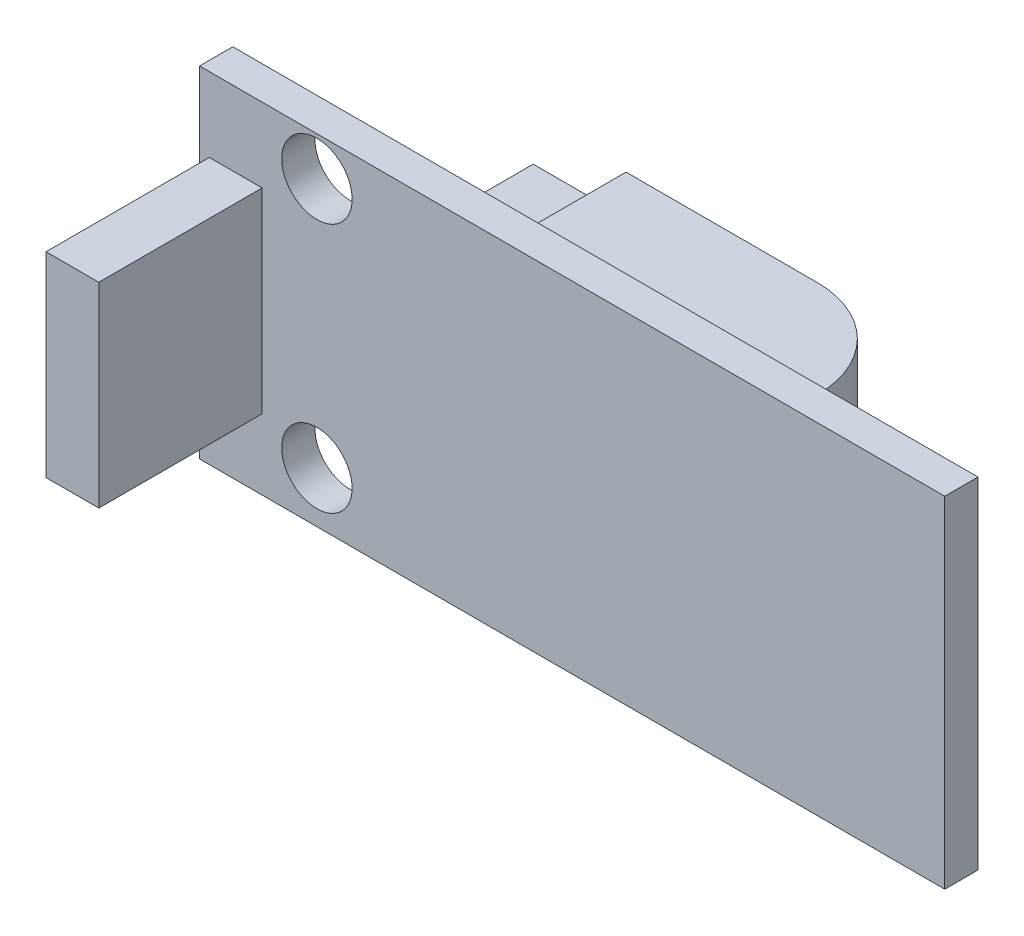
ISO-10303-21;
HEADER;
FILE_DESCRIPTION(('STEP AP214'),'2;1');
FILE_NAME('part.step','',(''),(''),'','','');
FILE_SCHEMA(('AUTOMOTIVE_DESIGN { 1 0 10303 214 1 1 1 1 }'));
ENDSEC;
DATA;
#1=APPLICATION_CONTEXT('core data for automotive mechanical design processes');
#2=APPLICATION_PROTOCOL_DEFINITION('international standard','automotive_design',2000,#1);
#3=PRODUCT_CONTEXT('',#1,'mechanical');
#4=PRODUCT('Part','Part','',(#3));
#5=PRODUCT_RELATED_PRODUCT_CATEGORY('part','',(#4));
#6=PRODUCT_DEFINITION_FORMATION('','',#4);
#7=PRODUCT_DEFINITION_CONTEXT('part definition',#1,'design');
#8=PRODUCT_DEFINITION('design','',#6,#7);
#9=PRODUCT_DEFINITION_SHAPE('','',#8);
#10=(LENGTH_UNIT() NAMED_UNIT(*) SI_UNIT(.MILLI.,.METRE.));
#11=(NAMED_UNIT(*) PLANE_ANGLE_UNIT() SI_UNIT($,.RADIAN.));
#12=(NAMED_UNIT(*) SI_UNIT($,.STERADIAN.) SOLID_ANGLE_UNIT());
#13=UNCERTAINTY_MEASURE_WITH_UNIT(LENGTH_MEASURE(1.E-05),#10,'distance_accuracy_value','');
#14=(GEOMETRIC_REPRESENTATION_CONTEXT(3) GLOBAL_UNCERTAINTY_ASSIGNED_CONTEXT((#13)) GLOBAL_UNIT_ASSIGNED_CONTEXT((#10,
#11,#12)) REPRESENTATION_CONTEXT('',''));
#15=CARTESIAN_POINT('',(0.,0.,0.));
#16=DIRECTION('',(0.,0.,1.));
#17=DIRECTION('',(1.,0.,0.));
#18=AXIS2_PLACEMENT_3D('',#15,#16,#17);
#19=CARTESIAN_POINT('',(0.,0.,0.));
#20=DIRECTION('',(0.,0.,-1.));
#21=DIRECTION('',(-1.,0.,0.));
#22=AXIS2_PLACEMENT_3D('',#19,#20,#21);
#23=PLANE('',#22);
#24=DIRECTION('',(0.,1.,0.));
#25=VECTOR('',#24,1.);
#26=CARTESIAN_POINT('',(-18.55,0.,0.));
#27=LINE('',#26,#25);
#28=CARTESIAN_POINT('',(-18.55,-5.1,0.));
#29=VERTEX_POINT('',#28);
#30=CARTESIAN_POINT('',(-18.55,4.9,0.));
#31=VERTEX_POINT('',#30);
#32=EDGE_CURVE('E346',#29,#31,#27,.T.);
#33=ORIENTED_EDGE('',*,*,#32,.F.);
#34=DIRECTION('',(-1.,0.,0.));
#35=VECTOR('',#34,1.);
#36=CARTESIAN_POINT('',(0.,-5.1,0.));
#37=LINE('',#36,#35);
#38=CARTESIAN_POINT('',(-15.85,-5.1,0.));
#39=VERTEX_POINT('',#38);
#40=EDGE_CURVE('E338',#39,#29,#37,.T.);
#41=ORIENTED_EDGE('',*,*,#40,.F.);
#42=DIRECTION('',(0.,-1.,0.));
#43=VECTOR('',#42,1.);
#44=CARTESIAN_POINT('',(-15.85,0.,0.));
#45=LINE('',#44,#43);
#46=CARTESIAN_POINT('',(-15.85,4.9,0.));
#47=VERTEX_POINT('',#46);
#48=EDGE_CURVE('E341',#47,#39,#45,.T.);
#49=ORIENTED_EDGE('',*,*,#48,.F.);
#50=DIRECTION('',(1.,0.,0.));
#51=VECTOR('',#50,1.);
#52=CARTESIAN_POINT('',(0.,4.9,0.));
#53=LINE('',#52,#51);
#54=EDGE_CURVE('E342',#31,#47,#53,.T.);
#55=ORIENTED_EDGE('',*,*,#54,.F.);
#56=EDGE_LOOP('',(#33,#41,#49,#55));
#57=FACE_BOUND('',#56,.T.);
#58=CARTESIAN_POINT('',(-13.05,6.7,0.));
#59=DIRECTION('',(0.,0.,1.));
#60=DIRECTION('',(1.,0.,0.));
#61=AXIS2_PLACEMENT_3D('',#58,#59,#60);
#62=CIRCLE('',#61,1.8);
#63=CARTESIAN_POINT('',(-11.25,6.7,0.));
#64=VERTEX_POINT('',#63);
#65=EDGE_CURVE('E304',#64,#64,#62,.T.);
#66=ORIENTED_EDGE('',*,*,#65,.T.);
#67=EDGE_LOOP('',(#66));
#68=FACE_BOUND('',#67,.T.);
#69=DIRECTION('',(-1.,0.,0.));
#70=VECTOR('',#69,1.);
#71=CARTESIAN_POINT('',(19.05,8.7,0.));
#72=LINE('',#71,#70);
#73=CARTESIAN_POINT('',(19.05,8.7,0.));
#74=VERTEX_POINT('',#73);
#75=CARTESIAN_POINT('',(-19.05,8.7,0.));
#76=VERTEX_POINT('',#75);
#77=EDGE_CURVE('E307',#74,#76,#72,.T.);
#78=ORIENTED_EDGE('',*,*,#77,.F.);
#79=DIRECTION('',(0.,1.,0.));
#80=VECTOR('',#79,1.);
#81=CARTESIAN_POINT('',(19.05,-8.7,0.));
#82=LINE('',#81,#80);
#83=CARTESIAN_POINT('',(19.05,-8.7,0.));
#84=VERTEX_POINT('',#83);
#85=EDGE_CURVE('E314',#84,#74,#82,.T.);
#86=ORIENTED_EDGE('',*,*,#85,.F.);
#87=DIRECTION('',(1.,0.,0.));
#88=VECTOR('',#87,1.);
#89=CARTESIAN_POINT('',(19.05,-8.7,0.));
#90=LINE('',#89,#88);
#91=CARTESIAN_POINT('',(-19.05,-8.7,0.));
#92=VERTEX_POINT('',#91);
#93=EDGE_CURVE('E324',#92,#84,#90,.T.);
#94=ORIENTED_EDGE('',*,*,#93,.F.);
#95=DIRECTION('',(0.,-1.,0.));
#96=VECTOR('',#95,1.);
#97=CARTESIAN_POINT('',(-19.05,-8.7,0.));
#98=LINE('',#97,#96);
#99=EDGE_CURVE('E323',#76,#92,#98,.T.);
#100=ORIENTED_EDGE('',*,*,#99,.F.);
#101=EDGE_LOOP('',(#78,#86,#94,#100));
#102=FACE_BOUND('',#101,.T.);
#103=CARTESIAN_POINT('',(-13.05,-6.1,0.));
#104=DIRECTION('',(0.,0.,1.));
#105=DIRECTION('',(1.,0.,0.));
#106=AXIS2_PLACEMENT_3D('',#103,#104,#105);
#107=CIRCLE('',#106,1.8);
#108=CARTESIAN_POINT('',(-11.25,-6.1,0.));
#109=VERTEX_POINT('',#108);
#110=EDGE_CURVE('E296',#109,#109,#107,.T.);
#111=ORIENTED_EDGE('',*,*,#110,.T.);
#112=EDGE_LOOP('',(#111));
#113=FACE_BOUND('',#112,.T.);
#114=DIRECTION('',(1.,0.,0.));
#115=VECTOR('',#114,1.);
#116=CARTESIAN_POINT('',(-10.6906250632349,4.18226650825444,0.));
#117=LINE('',#116,#115);
#118=CARTESIAN_POINT('',(-10.6906250632349,4.18226650825444,0.));
#119=VERTEX_POINT('',#118);
#120=CARTESIAN_POINT('',(-5.94445745274382,4.18226650825444,0.));
#121=VERTEX_POINT('',#120);
#122=EDGE_CURVE('E429',#119,#121,#117,.T.);
#123=ORIENTED_EDGE('',*,*,#122,.F.);
#124=DIRECTION('',(0.,1.,0.));
#125=VECTOR('',#124,1.);
#126=CARTESIAN_POINT('',(-10.6906250632349,4.18226650825444,0.));
#127=LINE('',#126,#125);
#128=CARTESIAN_POINT('',(-10.6906250632349,-4.46421705937278,0.));
#129=VERTEX_POINT('',#128);
#130=EDGE_CURVE('E236',#129,#119,#127,.T.);
#131=ORIENTED_EDGE('',*,*,#130,.F.);
#132=DIRECTION('',(-1.,0.,0.));
#133=VECTOR('',#132,1.);
#134=CARTESIAN_POINT('',(-10.6906250632349,-4.46421705937278,0.));
#135=LINE('',#134,#133);
#136=CARTESIAN_POINT('',(-5.85047393570431,-4.46421705937278,0.));
#137=VERTEX_POINT('',#136);
#138=EDGE_CURVE('E233',#137,#129,#135,.T.);
#139=ORIENTED_EDGE('',*,*,#138,.F.);
#140=DIRECTION('',(0.,1.,0.));
#141=VECTOR('',#140,1.);
#142=CARTESIAN_POINT('',(-5.85047393570431,-4.46421705937278,0.));
#143=LINE('',#142,#141);
#144=CARTESIAN_POINT('',(-5.85047393570431,-6.10892860756279,0.));
#145=VERTEX_POINT('',#144);
#146=EDGE_CURVE('E445',#145,#137,#143,.T.);
#147=ORIENTED_EDGE('',*,*,#146,.F.);
#148=DIRECTION('',(-1.,0.,0.));
#149=VECTOR('',#148,1.);
#150=CARTESIAN_POINT('',(-5.85047393570431,-6.10892860756279,0.));
#151=LINE('',#150,#149);
#152=CARTESIAN_POINT('',(8.81095472244626,-6.10892860756279,0.));
#153=VERTEX_POINT('',#152);
#154=EDGE_CURVE('E439',#153,#145,#151,.T.);
#155=ORIENTED_EDGE('',*,*,#154,.F.);
#156=DIRECTION('',(0.,-1.,0.));
#157=VECTOR('',#156,1.);
#158=CARTESIAN_POINT('',(8.81095472244626,-2.49056320154484,0.));
#159=LINE('',#158,#157);
#160=CARTESIAN_POINT('',(8.81095472244626,-2.49056320154484,0.));
#161=VERTEX_POINT('',#160);
#162=EDGE_CURVE('E394',#161,#153,#159,.T.);
#163=ORIENTED_EDGE('',*,*,#162,.F.);
#164=DIRECTION('',(1.,0.,0.));
#165=VECTOR('',#164,1.);
#166=CARTESIAN_POINT('',(1.71519918596956,-2.49056320154484,0.));
#167=LINE('',#166,#165);
#168=CARTESIAN_POINT('',(1.71519918596956,-2.49056320154484,0.));
#169=VERTEX_POINT('',#168);
#170=EDGE_CURVE('E440',#169,#161,#167,.T.);
#171=ORIENTED_EDGE('',*,*,#170,.F.);
#172=DIRECTION('',(0.,-1.,0.));
#173=VECTOR('',#172,1.);
#174=CARTESIAN_POINT('',(1.71519918596956,2.39657968450545,0.));
#175=LINE('',#174,#173);
#176=CARTESIAN_POINT('',(1.71519918596956,2.39657968450545,0.));
#177=VERTEX_POINT('',#176);
#178=EDGE_CURVE('E434',#177,#169,#175,.T.);
#179=ORIENTED_EDGE('',*,*,#178,.F.);
#180=DIRECTION('',(-1.,0.,0.));
#181=VECTOR('',#180,1.);
#182=CARTESIAN_POINT('',(1.71519918596956,2.39657968450545,0.));
#183=LINE('',#182,#181);
#184=CARTESIAN_POINT('',(8.81095472244626,2.39657968450545,0.));
#185=VERTEX_POINT('',#184);
#186=EDGE_CURVE('E428',#185,#177,#183,.T.);
#187=ORIENTED_EDGE('',*,*,#186,.F.);
#188=DIRECTION('',(0.,-1.,0.));
#189=VECTOR('',#188,1.);
#190=CARTESIAN_POINT('',(8.81095472244626,6.20291212460223,0.));
#191=LINE('',#190,#189);
#192=CARTESIAN_POINT('',(8.81095472244626,6.20291212460223,0.));
#193=VERTEX_POINT('',#192);
#194=EDGE_CURVE('E426',#193,#185,#191,.T.);
#195=ORIENTED_EDGE('',*,*,#194,.F.);
#196=DIRECTION('',(1.,0.,0.));
#197=VECTOR('',#196,1.);
#198=CARTESIAN_POINT('',(-5.94445745274382,6.20291212460223,0.));
#199=LINE('',#198,#197);
#200=CARTESIAN_POINT('',(-5.94445745274382,6.20291212460223,0.));
#201=VERTEX_POINT('',#200);
#202=EDGE_CURVE('E418',#201,#193,#199,.T.);
#203=ORIENTED_EDGE('',*,*,#202,.F.);
#204=DIRECTION('',(0.,1.,0.));
#205=VECTOR('',#204,1.);
#206=CARTESIAN_POINT('',(-5.94445745274382,6.20291212460223,0.));
#207=LINE('',#206,#205);
#208=EDGE_CURVE('E421',#121,#201,#207,.T.);
#209=ORIENTED_EDGE('',*,*,#208,.F.);
#210=EDGE_LOOP('',(#123,#131,#139,#147,#155,#163,#171,#179,#187,#195,#203,#209));
#211=FACE_BOUND('',#210,.T.);
#212=ADVANCED_FACE('F43',(#57,#68,#102,#113,#211),#23,.T.);
#213=CARTESIAN_POINT('',(0.,0.,1.7));
#214=DIRECTION('',(0.,0.,-1.));
#215=DIRECTION('',(-1.,0.,0.));
#216=AXIS2_PLACEMENT_3D('',#213,#214,#215);
#217=PLANE('',#216);
#218=DIRECTION('',(-1.,0.,0.));
#219=VECTOR('',#218,1.);
#220=CARTESIAN_POINT('',(0.,-5.1,1.7));
#221=LINE('',#220,#219);
#222=CARTESIAN_POINT('',(-15.85,-5.1,1.7));
#223=VERTEX_POINT('',#222);
#224=CARTESIAN_POINT('',(-18.55,-5.1,1.7));
#225=VERTEX_POINT('',#224);
#226=EDGE_CURVE('E272',#223,#225,#221,.T.);
#227=ORIENTED_EDGE('',*,*,#226,.T.);
#228=DIRECTION('',(0.,1.,0.));
#229=VECTOR('',#228,1.);
#230=CARTESIAN_POINT('',(-18.55,0.,1.7));
#231=LINE('',#230,#229);
#232=CARTESIAN_POINT('',(-18.55,4.9,1.7));
#233=VERTEX_POINT('',#232);
#234=EDGE_CURVE('E294',#225,#233,#231,.T.);
#235=ORIENTED_EDGE('',*,*,#234,.T.);
#236=DIRECTION('',(1.,0.,0.));
#237=VECTOR('',#236,1.);
#238=CARTESIAN_POINT('',(0.,4.9,1.7));
#239=LINE('',#238,#237);
#240=CARTESIAN_POINT('',(-15.85,4.9,1.7));
#241=VERTEX_POINT('',#240);
#242=EDGE_CURVE('E292',#233,#241,#239,.T.);
#243=ORIENTED_EDGE('',*,*,#242,.T.);
#244=DIRECTION('',(0.,-1.,0.));
#245=VECTOR('',#244,1.);
#246=CARTESIAN_POINT('',(-15.85,0.,1.7));
#247=LINE('',#246,#245);
#248=EDGE_CURVE('E290',#241,#223,#247,.T.);
#249=ORIENTED_EDGE('',*,*,#248,.T.);
#250=EDGE_LOOP('',(#227,#235,#243,#249));
#251=FACE_BOUND('',#250,.T.);
#252=DIRECTION('',(-1.,0.,0.));
#253=VECTOR('',#252,1.);
#254=CARTESIAN_POINT('',(19.05,8.7,1.7));
#255=LINE('',#254,#253);
#256=CARTESIAN_POINT('',(19.05,8.7,1.7));
#257=VERTEX_POINT('',#256);
#258=CARTESIAN_POINT('',(-19.05,8.7,1.7));
#259=VERTEX_POINT('',#258);
#260=EDGE_CURVE('E309',#257,#259,#255,.T.);
#261=ORIENTED_EDGE('',*,*,#260,.T.);
#262=DIRECTION('',(0.,-1.,0.));
#263=VECTOR('',#262,1.);
#264=CARTESIAN_POINT('',(-19.05,-8.7,1.7));
#265=LINE('',#264,#263);
#266=CARTESIAN_POINT('',(-19.05,-8.7,1.7));
#267=VERTEX_POINT('',#266);
#268=EDGE_CURVE('E311',#259,#267,#265,.T.);
#269=ORIENTED_EDGE('',*,*,#268,.T.);
#270=DIRECTION('',(1.,0.,0.));
#271=VECTOR('',#270,1.);
#272=CARTESIAN_POINT('',(19.05,-8.7,1.7));
#273=LINE('',#272,#271);
#274=CARTESIAN_POINT('',(19.05,-8.7,1.7));
#275=VERTEX_POINT('',#274);
#276=EDGE_CURVE('E316',#267,#275,#273,.T.);
#277=ORIENTED_EDGE('',*,*,#276,.T.);
#278=DIRECTION('',(0.,1.,0.));
#279=VECTOR('',#278,1.);
#280=CARTESIAN_POINT('',(19.05,-8.7,1.7));
#281=LINE('',#280,#279);
#282=EDGE_CURVE('E318',#275,#257,#281,.T.);
#283=ORIENTED_EDGE('',*,*,#282,.T.);
#284=EDGE_LOOP('',(#261,#269,#277,#283));
#285=FACE_BOUND('',#284,.T.);
#286=CARTESIAN_POINT('',(-13.05,6.7,1.7));
#287=DIRECTION('',(0.,0.,1.));
#288=DIRECTION('',(1.,0.,0.));
#289=AXIS2_PLACEMENT_3D('',#286,#287,#288);
#290=CIRCLE('',#289,1.8);
#291=CARTESIAN_POINT('',(-11.25,6.7,1.7));
#292=VERTEX_POINT('',#291);
#293=EDGE_CURVE('E303',#292,#292,#290,.T.);
#294=ORIENTED_EDGE('',*,*,#293,.F.);
#295=EDGE_LOOP('',(#294));
#296=FACE_BOUND('',#295,.T.);
#297=CARTESIAN_POINT('',(-13.05,-6.1,1.7));
#298=DIRECTION('',(0.,0.,1.));
#299=DIRECTION('',(1.,0.,0.));
#300=AXIS2_PLACEMENT_3D('',#297,#298,#299);
#301=CIRCLE('',#300,1.8);
#302=CARTESIAN_POINT('',(-11.25,-6.1,1.7));
#303=VERTEX_POINT('',#302);
#304=EDGE_CURVE('E300',#303,#303,#301,.T.);
#305=ORIENTED_EDGE('',*,*,#304,.F.);
#306=EDGE_LOOP('',(#305));
#307=FACE_BOUND('',#306,.T.);
#308=ADVANCED_FACE('F476',(#251,#285,#296,#307),#217,.F.);
#309=CARTESIAN_POINT('',(19.05,8.7,1.7));
#310=DIRECTION('',(0.,-1.,0.));
#311=DIRECTION('',(0.,0.,-1.));
#312=AXIS2_PLACEMENT_3D('',#309,#310,#311);
#313=PLANE('',#312);
#314=ORIENTED_EDGE('',*,*,#77,.T.);
#315=DIRECTION('',(0.,0.,-1.));
#316=VECTOR('',#315,1.);
#317=CARTESIAN_POINT('',(-19.05,8.7,1.7));
#318=LINE('',#317,#316);
#319=EDGE_CURVE('E339',#259,#76,#318,.T.);
#320=ORIENTED_EDGE('',*,*,#319,.F.);
#321=ORIENTED_EDGE('',*,*,#260,.F.);
#322=DIRECTION('',(0.,0.,-1.));
#323=VECTOR('',#322,1.);
#324=CARTESIAN_POINT('',(19.05,8.7,1.7));
#325=LINE('',#324,#323);
#326=EDGE_CURVE('E319',#257,#74,#325,.T.);
#327=ORIENTED_EDGE('',*,*,#326,.T.);
#328=EDGE_LOOP('',(#314,#320,#321,#327));
#329=FACE_BOUND('',#328,.T.);
#330=ADVANCED_FACE('F486',(#329),#313,.F.);
#331=CARTESIAN_POINT('',(-19.05,-8.7,1.7));
#332=DIRECTION('',(1.,0.,0.));
#333=DIRECTION('',(0.,0.,-1.));
#334=AXIS2_PLACEMENT_3D('',#331,#332,#333);
#335=PLANE('',#334);
#336=ORIENTED_EDGE('',*,*,#99,.T.);
#337=DIRECTION('',(0.,0.,-1.));
#338=VECTOR('',#337,1.);
#339=CARTESIAN_POINT('',(-19.05,-8.7,1.7));
#340=LINE('',#339,#338);
#341=EDGE_CURVE('E334',#267,#92,#340,.T.);
#342=ORIENTED_EDGE('',*,*,#341,.F.);
#343=ORIENTED_EDGE('',*,*,#268,.F.);
#344=ORIENTED_EDGE('',*,*,#319,.T.);
#345=EDGE_LOOP('',(#336,#342,#343,#344));
#346=FACE_BOUND('',#345,.T.);
#347=ADVANCED_FACE('F498',(#346),#335,.F.);
#348=CARTESIAN_POINT('',(19.05,-8.7,1.7));
#349=DIRECTION('',(0.,1.,0.));
#350=DIRECTION('',(0.,0.,1.));
#351=AXIS2_PLACEMENT_3D('',#348,#349,#350);
#352=PLANE('',#351);
#353=ORIENTED_EDGE('',*,*,#93,.T.);
#354=DIRECTION('',(0.,0.,-1.));
#355=VECTOR('',#354,1.);
#356=CARTESIAN_POINT('',(19.05,-8.7,1.7));
#357=LINE('',#356,#355);
#358=EDGE_CURVE('E329',#275,#84,#357,.T.);
#359=ORIENTED_EDGE('',*,*,#358,.F.);
#360=ORIENTED_EDGE('',*,*,#276,.F.);
#361=ORIENTED_EDGE('',*,*,#341,.T.);
#362=EDGE_LOOP('',(#353,#359,#360,#361));
#363=FACE_BOUND('',#362,.T.);
#364=ADVANCED_FACE('F497',(#363),#352,.F.);
#365=CARTESIAN_POINT('',(19.05,-8.7,1.7));
#366=DIRECTION('',(-1.,0.,0.));
#367=DIRECTION('',(0.,0.,1.));
#368=AXIS2_PLACEMENT_3D('',#365,#366,#367);
#369=PLANE('',#368);
#370=ORIENTED_EDGE('',*,*,#85,.T.);
#371=ORIENTED_EDGE('',*,*,#326,.F.);
#372=ORIENTED_EDGE('',*,*,#282,.F.);
#373=ORIENTED_EDGE('',*,*,#358,.T.);
#374=EDGE_LOOP('',(#370,#371,#372,#373));
#375=FACE_BOUND('',#374,.T.);
#376=ADVANCED_FACE('F495',(#375),#369,.F.);
#377=CARTESIAN_POINT('',(-13.05,6.7,1.7));
#378=DIRECTION('',(0.,0.,-1.));
#379=DIRECTION('',(-1.,0.,0.));
#380=AXIS2_PLACEMENT_3D('',#377,#378,#379);
#381=CYLINDRICAL_SURFACE('',#380,1.8);
#382=ORIENTED_EDGE('',*,*,#293,.T.);
#383=EDGE_LOOP('',(#382));
#384=FACE_BOUND('',#383,.T.);
#385=ORIENTED_EDGE('',*,*,#65,.F.);
#386=EDGE_LOOP('',(#385));
#387=FACE_BOUND('',#386,.T.);
#388=ADVANCED_FACE('F494',(#384,#387),#381,.F.);
#389=CARTESIAN_POINT('',(-13.05,-6.1,1.7));
#390=DIRECTION('',(0.,0.,-1.));
#391=DIRECTION('',(-1.,0.,0.));
#392=AXIS2_PLACEMENT_3D('',#389,#390,#391);
#393=CYLINDRICAL_SURFACE('',#392,1.8);
#394=ORIENTED_EDGE('',*,*,#304,.T.);
#395=EDGE_LOOP('',(#394));
#396=FACE_BOUND('',#395,.T.);
#397=ORIENTED_EDGE('',*,*,#110,.F.);
#398=EDGE_LOOP('',(#397));
#399=FACE_BOUND('',#398,.T.);
#400=ADVANCED_FACE('F710',(#396,#399),#393,.F.);
#401=CARTESIAN_POINT('',(0.,0.,-0.65));
#402=DIRECTION('',(0.,0.,1.));
#403=DIRECTION('',(1.,0.,0.));
#404=AXIS2_PLACEMENT_3D('',#401,#402,#403);
#405=PLANE('',#404);
#406=DIRECTION('',(0.,-1.,0.));
#407=VECTOR('',#406,1.);
#408=CARTESIAN_POINT('',(-18.55,4.9,-0.65));
#409=LINE('',#408,#407);
#410=CARTESIAN_POINT('',(-18.55,4.9,-0.65));
#411=VERTEX_POINT('',#410);
#412=CARTESIAN_POINT('',(-18.55,-5.1,-0.65));
#413=VERTEX_POINT('',#412);
#414=EDGE_CURVE('E260',#411,#413,#409,.T.);
#415=ORIENTED_EDGE('',*,*,#414,.F.);
#416=DIRECTION('',(-1.,0.,0.));
#417=VECTOR('',#416,1.);
#418=CARTESIAN_POINT('',(-18.55,4.9,-0.65));
#419=LINE('',#418,#417);
#420=CARTESIAN_POINT('',(-15.85,4.9,-0.65));
#421=VERTEX_POINT('',#420);
#422=EDGE_CURVE('E266',#421,#411,#419,.T.);
#423=ORIENTED_EDGE('',*,*,#422,.F.);
#424=DIRECTION('',(0.,1.,0.));
#425=VECTOR('',#424,1.);
#426=CARTESIAN_POINT('',(-15.85,4.9,-0.65));
#427=LINE('',#426,#425);
#428=CARTESIAN_POINT('',(-15.85,-5.1,-0.65));
#429=VERTEX_POINT('',#428);
#430=EDGE_CURVE('E263',#429,#421,#427,.T.);
#431=ORIENTED_EDGE('',*,*,#430,.F.);
#432=DIRECTION('',(1.,0.,0.));
#433=VECTOR('',#432,1.);
#434=CARTESIAN_POINT('',(-18.55,-5.1,-0.65));
#435=LINE('',#434,#433);
#436=EDGE_CURVE('E257',#413,#429,#435,.T.);
#437=ORIENTED_EDGE('',*,*,#436,.F.);
#438=EDGE_LOOP('',(#415,#423,#431,#437));
#439=FACE_BOUND('',#438,.T.);
#440=ADVANCED_FACE('F699',(#439),#405,.F.);
#441=CARTESIAN_POINT('',(-18.55,-5.1,-0.65));
#442=DIRECTION('',(0.,-1.,0.));
#443=DIRECTION('',(0.,0.,-1.));
#444=AXIS2_PLACEMENT_3D('',#441,#442,#443);
#445=PLANE('',#444);
#446=DIRECTION('',(0.,0.,1.));
#447=VECTOR('',#446,1.);
#448=CARTESIAN_POINT('',(-15.85,-5.1,-0.65));
#449=LINE('',#448,#447);
#450=EDGE_CURVE('E276',#429,#39,#449,.T.);
#451=ORIENTED_EDGE('',*,*,#450,.T.);
#452=ORIENTED_EDGE('',*,*,#40,.T.);
#453=DIRECTION('',(0.,0.,1.));
#454=VECTOR('',#453,1.);
#455=CARTESIAN_POINT('',(-18.55,-5.1,-0.65));
#456=LINE('',#455,#454);
#457=EDGE_CURVE('E285',#413,#29,#456,.T.);
#458=ORIENTED_EDGE('',*,*,#457,.F.);
#459=ORIENTED_EDGE('',*,*,#436,.T.);
#460=EDGE_LOOP('',(#451,#452,#458,#459));
#461=FACE_BOUND('',#460,.T.);
#462=ADVANCED_FACE('F645',(#461),#445,.T.);
#463=CARTESIAN_POINT('',(-15.85,4.9,-0.65));
#464=DIRECTION('',(1.,0.,0.));
#465=DIRECTION('',(0.,0.,-1.));
#466=AXIS2_PLACEMENT_3D('',#463,#464,#465);
#467=PLANE('',#466);
#468=DIRECTION('',(0.,0.,1.));
#469=VECTOR('',#468,1.);
#470=CARTESIAN_POINT('',(-15.85,4.9,-0.65));
#471=LINE('',#470,#469);
#472=EDGE_CURVE('E274',#421,#47,#471,.T.);
#473=ORIENTED_EDGE('',*,*,#472,.T.);
#474=ORIENTED_EDGE('',*,*,#48,.T.);
#475=ORIENTED_EDGE('',*,*,#450,.F.);
#476=ORIENTED_EDGE('',*,*,#430,.T.);
#477=EDGE_LOOP('',(#473,#474,#475,#476));
#478=FACE_BOUND('',#477,.T.);
#479=ADVANCED_FACE('F655',(#478),#467,.T.);
#480=CARTESIAN_POINT('',(-18.55,4.9,-0.65));
#481=DIRECTION('',(0.,1.,0.));
#482=DIRECTION('',(0.,0.,1.));
#483=AXIS2_PLACEMENT_3D('',#480,#481,#482);
#484=PLANE('',#483);
#485=DIRECTION('',(0.,0.,1.));
#486=VECTOR('',#485,1.);
#487=CARTESIAN_POINT('',(-18.55,4.9,-0.65));
#488=LINE('',#487,#486);
#489=EDGE_CURVE('E269',#411,#31,#488,.T.);
#490=ORIENTED_EDGE('',*,*,#489,.T.);
#491=ORIENTED_EDGE('',*,*,#54,.T.);
#492=ORIENTED_EDGE('',*,*,#472,.F.);
#493=ORIENTED_EDGE('',*,*,#422,.T.);
#494=EDGE_LOOP('',(#490,#491,#492,#493));
#495=FACE_BOUND('',#494,.T.);
#496=ADVANCED_FACE('F665',(#495),#484,.T.);
#497=CARTESIAN_POINT('',(-18.55,4.9,-0.65));
#498=DIRECTION('',(-1.,0.,0.));
#499=DIRECTION('',(0.,0.,1.));
#500=AXIS2_PLACEMENT_3D('',#497,#498,#499);
#501=PLANE('',#500);
#502=ORIENTED_EDGE('',*,*,#457,.T.);
#503=ORIENTED_EDGE('',*,*,#32,.T.);
#504=ORIENTED_EDGE('',*,*,#489,.F.);
#505=ORIENTED_EDGE('',*,*,#414,.T.);
#506=EDGE_LOOP('',(#502,#503,#504,#505));
#507=FACE_BOUND('',#506,.T.);
#508=ADVANCED_FACE('F668',(#507),#501,.T.);
#509=ORIENTED_EDGE('',*,*,#234,.F.);
#510=CARTESIAN_POINT('',(-18.55,-5.1,10.05));
#511=VERTEX_POINT('',#510);
#512=EDGE_CURVE('E267',#225,#511,#456,.T.);
#513=ORIENTED_EDGE('',*,*,#512,.T.);
#514=DIRECTION('',(0.,-1.,0.));
#515=VECTOR('',#514,1.);
#516=CARTESIAN_POINT('',(-18.55,4.9,10.05));
#517=LINE('',#516,#515);
#518=CARTESIAN_POINT('',(-18.55,4.9,10.05));
#519=VERTEX_POINT('',#518);
#520=EDGE_CURVE('E238',#519,#511,#517,.T.);
#521=ORIENTED_EDGE('',*,*,#520,.F.);
#522=EDGE_CURVE('E273',#233,#519,#488,.T.);
#523=ORIENTED_EDGE('',*,*,#522,.F.);
#524=EDGE_LOOP('',(#509,#513,#521,#523));
#525=FACE_BOUND('',#524,.T.);
#526=ADVANCED_FACE('F658',(#525),#501,.T.);
#527=ORIENTED_EDGE('',*,*,#242,.F.);
#528=ORIENTED_EDGE('',*,*,#522,.T.);
#529=DIRECTION('',(-1.,0.,0.));
#530=VECTOR('',#529,1.);
#531=CARTESIAN_POINT('',(-18.55,4.9,10.05));
#532=LINE('',#531,#530);
#533=CARTESIAN_POINT('',(-15.85,4.9,10.05));
#534=VERTEX_POINT('',#533);
#535=EDGE_CURVE('E255',#534,#519,#532,.T.);
#536=ORIENTED_EDGE('',*,*,#535,.F.);
#537=EDGE_CURVE('E279',#241,#534,#471,.T.);
#538=ORIENTED_EDGE('',*,*,#537,.F.);
#539=EDGE_LOOP('',(#527,#528,#536,#538));
#540=FACE_BOUND('',#539,.T.);
#541=ADVANCED_FACE('F647',(#540),#484,.T.);
#542=ORIENTED_EDGE('',*,*,#248,.F.);
#543=ORIENTED_EDGE('',*,*,#537,.T.);
#544=DIRECTION('',(0.,1.,0.));
#545=VECTOR('',#544,1.);
#546=CARTESIAN_POINT('',(-15.85,4.9,10.05));
#547=LINE('',#546,#545);
#548=CARTESIAN_POINT('',(-15.85,-5.1,10.05));
#549=VERTEX_POINT('',#548);
#550=EDGE_CURVE('E253',#549,#534,#547,.T.);
#551=ORIENTED_EDGE('',*,*,#550,.F.);
#552=EDGE_CURVE('E281',#223,#549,#449,.T.);
#553=ORIENTED_EDGE('',*,*,#552,.F.);
#554=EDGE_LOOP('',(#542,#543,#551,#553));
#555=FACE_BOUND('',#554,.T.);
#556=ADVANCED_FACE('F640',(#555),#467,.T.);
#557=ORIENTED_EDGE('',*,*,#226,.F.);
#558=ORIENTED_EDGE('',*,*,#552,.T.);
#559=DIRECTION('',(1.,0.,0.));
#560=VECTOR('',#559,1.);
#561=CARTESIAN_POINT('',(-18.55,-5.1,10.05));
#562=LINE('',#561,#560);
#563=EDGE_CURVE('E245',#511,#549,#562,.T.);
#564=ORIENTED_EDGE('',*,*,#563,.F.);
#565=ORIENTED_EDGE('',*,*,#512,.F.);
#566=EDGE_LOOP('',(#557,#558,#564,#565));
#567=FACE_BOUND('',#566,.T.);
#568=ADVANCED_FACE('F627',(#567),#445,.T.);
#569=CARTESIAN_POINT('',(0.,0.,10.05));
#570=DIRECTION('',(0.,0.,1.));
#571=DIRECTION('',(1.,0.,0.));
#572=AXIS2_PLACEMENT_3D('',#569,#570,#571);
#573=PLANE('',#572);
#574=ORIENTED_EDGE('',*,*,#520,.T.);
#575=ORIENTED_EDGE('',*,*,#563,.T.);
#576=ORIENTED_EDGE('',*,*,#550,.T.);
#577=ORIENTED_EDGE('',*,*,#535,.T.);
#578=EDGE_LOOP('',(#574,#575,#576,#577));
#579=FACE_BOUND('',#578,.T.);
#580=ADVANCED_FACE('F620',(#579),#573,.T.);
#581=CARTESIAN_POINT('',(-10.6906250632349,4.18226650825444,-7.));
#582=DIRECTION('',(1.,0.,0.));
#583=DIRECTION('',(0.,0.,-1.));
#584=AXIS2_PLACEMENT_3D('',#581,#582,#583);
#585=PLANE('',#584);
#586=ORIENTED_EDGE('',*,*,#130,.T.);
#587=DIRECTION('',(0.,0.,1.));
#588=VECTOR('',#587,1.);
#589=CARTESIAN_POINT('',(-10.6906250632349,4.18226650825444,-7.));
#590=LINE('',#589,#588);
#591=CARTESIAN_POINT('',(-10.6906250632349,4.18226650825444,-7.));
#592=VERTEX_POINT('',#591);
#593=EDGE_CURVE('E220',#592,#119,#590,.T.);
#594=ORIENTED_EDGE('',*,*,#593,.F.);
#595=DIRECTION('',(0.,1.,0.));
#596=VECTOR('',#595,1.);
#597=CARTESIAN_POINT('',(-10.6906250632349,4.18226650825444,-7.));
#598=LINE('',#597,#596);
#599=CARTESIAN_POINT('',(-10.6906250632349,-4.46421705937278,-7.));
#600=VERTEX_POINT('',#599);
#601=EDGE_CURVE('E221',#600,#592,#598,.T.);
#602=ORIENTED_EDGE('',*,*,#601,.F.);
#603=DIRECTION('',(0.,0.,1.));
#604=VECTOR('',#603,1.);
#605=CARTESIAN_POINT('',(-10.6906250632349,-4.46421705937278,-7.));
#606=LINE('',#605,#604);
#607=EDGE_CURVE('E449',#600,#129,#606,.T.);
#608=ORIENTED_EDGE('',*,*,#607,.T.);
#609=EDGE_LOOP('',(#586,#594,#602,#608));
#610=FACE_BOUND('',#609,.T.);
#611=ADVANCED_FACE('F237',(#610),#585,.F.);
#612=CARTESIAN_POINT('',(-10.6906250632349,4.18226650825444,-7.));
#613=DIRECTION('',(0.,-1.,0.));
#614=DIRECTION('',(0.,0.,-1.));
#615=AXIS2_PLACEMENT_3D('',#612,#613,#614);
#616=PLANE('',#615);
#617=ORIENTED_EDGE('',*,*,#122,.T.);
#618=DIRECTION('',(0.,0.,1.));
#619=VECTOR('',#618,1.);
#620=CARTESIAN_POINT('',(-5.94445745274382,4.18226650825444,-7.));
#621=LINE('',#620,#619);
#622=CARTESIAN_POINT('',(-5.94445745274382,4.18226650825444,-7.));
#623=VERTEX_POINT('',#622);
#624=EDGE_CURVE('E219',#623,#121,#621,.T.);
#625=ORIENTED_EDGE('',*,*,#624,.F.);
#626=DIRECTION('',(1.,0.,0.));
#627=VECTOR('',#626,1.);
#628=CARTESIAN_POINT('',(-10.6906250632349,4.18226650825444,-7.));
#629=LINE('',#628,#627);
#630=EDGE_CURVE('E213',#592,#623,#629,.T.);
#631=ORIENTED_EDGE('',*,*,#630,.F.);
#632=ORIENTED_EDGE('',*,*,#593,.T.);
#633=EDGE_LOOP('',(#617,#625,#631,#632));
#634=FACE_BOUND('',#633,.T.);
#635=ADVANCED_FACE('F214',(#634),#616,.F.);
#636=CARTESIAN_POINT('',(-5.94445745274382,6.20291212460223,-7.));
#637=DIRECTION('',(1.,0.,0.));
#638=DIRECTION('',(0.,0.,-1.));
#639=AXIS2_PLACEMENT_3D('',#636,#637,#638);
#640=PLANE('',#639);
#641=ORIENTED_EDGE('',*,*,#208,.T.);
#642=DIRECTION('',(0.,0.,1.));
#643=VECTOR('',#642,1.);
#644=CARTESIAN_POINT('',(-5.94445745274382,6.20291212460223,-7.));
#645=LINE('',#644,#643);
#646=CARTESIAN_POINT('',(-5.94445745274382,6.20291212460223,-7.));
#647=VERTEX_POINT('',#646);
#648=EDGE_CURVE('E242',#647,#201,#645,.T.);
#649=ORIENTED_EDGE('',*,*,#648,.F.);
#650=DIRECTION('',(0.,1.,0.));
#651=VECTOR('',#650,1.);
#652=CARTESIAN_POINT('',(-5.94445745274382,6.20291212460223,-7.));
#653=LINE('',#652,#651);
#654=EDGE_CURVE('E224',#623,#647,#653,.T.);
#655=ORIENTED_EDGE('',*,*,#654,.F.);
#656=ORIENTED_EDGE('',*,*,#624,.T.);
#657=EDGE_LOOP('',(#641,#649,#655,#656));
#658=FACE_BOUND('',#657,.T.);
#659=ADVANCED_FACE('F469',(#658),#640,.F.);
#660=CARTESIAN_POINT('',(-5.94445745274382,6.20291212460223,-7.));
#661=DIRECTION('',(0.,-1.,0.));
#662=DIRECTION('',(0.,0.,-1.));
#663=AXIS2_PLACEMENT_3D('',#660,#661,#662);
#664=PLANE('',#663);
#665=DIRECTION('',(0.,0.,1.));
#666=VECTOR('',#665,1.);
#667=CARTESIAN_POINT('',(8.81095472244626,6.20291212460223,-7.));
#668=LINE('',#667,#666);
#669=CARTESIAN_POINT('',(8.81095472244626,6.20291212460223,-2.));
#670=VERTEX_POINT('',#669);
#671=EDGE_CURVE('E410',#670,#193,#668,.T.);
#672=ORIENTED_EDGE('',*,*,#671,.F.);
#673=CARTESIAN_POINT('',(3.81095472244626,6.20291212460223,-2.));
#674=DIRECTION('',(0.,-1.,0.));
#675=DIRECTION('',(0.,0.,-1.));
#676=AXIS2_PLACEMENT_3D('',#673,#674,#675);
#677=CIRCLE('',#676,5.);
#678=CARTESIAN_POINT('',(3.81095472244626,6.20291212460223,-7.));
#679=VERTEX_POINT('',#678);
#680=EDGE_CURVE('E11',#670,#679,#677,.F.);
#681=ORIENTED_EDGE('',*,*,#680,.T.);
#682=DIRECTION('',(1.,0.,0.));
#683=VECTOR('',#682,1.);
#684=CARTESIAN_POINT('',(-5.94445745274382,6.20291212460223,-7.));
#685=LINE('',#684,#683);
#686=EDGE_CURVE('E420',#647,#679,#685,.T.);
#687=ORIENTED_EDGE('',*,*,#686,.F.);
#688=ORIENTED_EDGE('',*,*,#648,.T.);
#689=ORIENTED_EDGE('',*,*,#202,.T.);
#690=EDGE_LOOP('',(#672,#681,#687,#688,#689));
#691=FACE_BOUND('',#690,.T.);
#692=ADVANCED_FACE('F412',(#691),#664,.F.);
#693=CARTESIAN_POINT('',(8.81095472244626,6.20291212460223,-7.));
#694=DIRECTION('',(-1.,0.,0.));
#695=DIRECTION('',(0.,-1.,0.));
#696=AXIS2_PLACEMENT_3D('',#693,#694,#695);
#697=PLANE('',#696);
#698=DIRECTION('',(0.,0.,1.));
#699=VECTOR('',#698,1.);
#700=CARTESIAN_POINT('',(8.81095472244626,2.39657968450545,-7.));
#701=LINE('',#700,#699);
#702=CARTESIAN_POINT('',(8.81095472244626,2.39657968450545,-2.));
#703=VERTEX_POINT('',#702);
#704=EDGE_CURVE('E409',#703,#185,#701,.T.);
#705=ORIENTED_EDGE('',*,*,#704,.F.);
#706=DIRECTION('',(0.,-1.,0.));
#707=VECTOR('',#706,1.);
#708=CARTESIAN_POINT('',(8.81095472244626,6.20291212460223,-2.));
#709=LINE('',#708,#707);
#710=EDGE_CURVE('E51',#703,#670,#709,.F.);
#711=ORIENTED_EDGE('',*,*,#710,.T.);
#712=ORIENTED_EDGE('',*,*,#671,.T.);
#713=ORIENTED_EDGE('',*,*,#194,.T.);
#714=EDGE_LOOP('',(#705,#711,#712,#713));
#715=FACE_BOUND('',#714,.T.);
#716=ADVANCED_FACE('F475',(#715),#697,.F.);
#717=CARTESIAN_POINT('',(1.71519918596956,2.39657968450545,-7.));
#718=DIRECTION('',(0.,1.,0.));
#719=DIRECTION('',(0.,0.,1.));
#720=AXIS2_PLACEMENT_3D('',#717,#718,#719);
#721=PLANE('',#720);
#722=DIRECTION('',(-1.,0.,0.));
#723=VECTOR('',#722,1.);
#724=CARTESIAN_POINT('',(1.71519918596956,2.39657968450545,-7.));
#725=LINE('',#724,#723);
#726=CARTESIAN_POINT('',(3.81095472244626,2.39657968450545,-7.));
#727=VERTEX_POINT('',#726);
#728=CARTESIAN_POINT('',(1.71519918596956,2.39657968450545,-7.));
#729=VERTEX_POINT('',#728);
#730=EDGE_CURVE('E461',#727,#729,#725,.T.);
#731=ORIENTED_EDGE('',*,*,#730,.F.);
#732=CARTESIAN_POINT('',(3.81095472244626,2.39657968450545,-2.));
#733=DIRECTION('',(0.,1.,0.));
#734=DIRECTION('',(0.,0.,1.));
#735=AXIS2_PLACEMENT_3D('',#732,#733,#734);
#736=CIRCLE('',#735,5.);
#737=EDGE_CURVE('E62',#727,#703,#736,.F.);
#738=ORIENTED_EDGE('',*,*,#737,.T.);
#739=ORIENTED_EDGE('',*,*,#704,.T.);
#740=ORIENTED_EDGE('',*,*,#186,.T.);
#741=DIRECTION('',(0.,0.,1.));
#742=VECTOR('',#741,1.);
#743=CARTESIAN_POINT('',(1.71519918596956,2.39657968450545,-7.));
#744=LINE('',#743,#742);
#745=EDGE_CURVE('E401',#729,#177,#744,.T.);
#746=ORIENTED_EDGE('',*,*,#745,.F.);
#747=EDGE_LOOP('',(#731,#738,#739,#740,#746));
#748=FACE_BOUND('',#747,.T.);
#749=ADVANCED_FACE('F530',(#748),#721,.F.);
#750=CARTESIAN_POINT('',(1.71519918596956,2.39657968450545,-7.));
#751=DIRECTION('',(-1.,0.,0.));
#752=DIRECTION('',(0.,0.,1.));
#753=AXIS2_PLACEMENT_3D('',#750,#751,#752);
#754=PLANE('',#753);
#755=ORIENTED_EDGE('',*,*,#178,.T.);
#756=DIRECTION('',(0.,0.,1.));
#757=VECTOR('',#756,1.);
#758=CARTESIAN_POINT('',(1.71519918596956,-2.49056320154484,-7.));
#759=LINE('',#758,#757);
#760=CARTESIAN_POINT('',(1.71519918596956,-2.49056320154484,-7.));
#761=VERTEX_POINT('',#760);
#762=EDGE_CURVE('E392',#761,#169,#759,.T.);
#763=ORIENTED_EDGE('',*,*,#762,.F.);
#764=DIRECTION('',(0.,-1.,0.));
#765=VECTOR('',#764,1.);
#766=CARTESIAN_POINT('',(1.71519918596956,2.39657968450545,-7.));
#767=LINE('',#766,#765);
#768=EDGE_CURVE('E380',#729,#761,#767,.T.);
#769=ORIENTED_EDGE('',*,*,#768,.F.);
#770=ORIENTED_EDGE('',*,*,#745,.T.);
#771=EDGE_LOOP('',(#755,#763,#769,#770));
#772=FACE_BOUND('',#771,.T.);
#773=ADVANCED_FACE('F527',(#772),#754,.F.);
#774=CARTESIAN_POINT('',(1.71519918596956,-2.49056320154484,-7.));
#775=DIRECTION('',(0.,-1.,0.));
#776=DIRECTION('',(0.,0.,-1.));
#777=AXIS2_PLACEMENT_3D('',#774,#775,#776);
#778=PLANE('',#777);
#779=DIRECTION('',(0.,0.,1.));
#780=VECTOR('',#779,1.);
#781=CARTESIAN_POINT('',(8.81095472244626,-2.49056320154484,-7.));
#782=LINE('',#781,#780);
#783=CARTESIAN_POINT('',(8.81095472244626,-2.49056320154484,-2.));
#784=VERTEX_POINT('',#783);
#785=EDGE_CURVE('E371',#784,#161,#782,.T.);
#786=ORIENTED_EDGE('',*,*,#785,.F.);
#787=CARTESIAN_POINT('',(3.81095472244626,-2.49056320154484,-2.));
#788=DIRECTION('',(0.,-1.,0.));
#789=DIRECTION('',(0.,0.,-1.));
#790=AXIS2_PLACEMENT_3D('',#787,#788,#789);
#791=CIRCLE('',#790,5.);
#792=CARTESIAN_POINT('',(3.81095472244626,-2.49056320154484,-7.));
#793=VERTEX_POINT('',#792);
#794=EDGE_CURVE('E363',#784,#793,#791,.F.);
#795=ORIENTED_EDGE('',*,*,#794,.T.);
#796=DIRECTION('',(1.,0.,0.));
#797=VECTOR('',#796,1.);
#798=CARTESIAN_POINT('',(1.71519918596956,-2.49056320154484,-7.));
#799=LINE('',#798,#797);
#800=EDGE_CURVE('E369',#761,#793,#799,.T.);
#801=ORIENTED_EDGE('',*,*,#800,.F.);
#802=ORIENTED_EDGE('',*,*,#762,.T.);
#803=ORIENTED_EDGE('',*,*,#170,.T.);
#804=EDGE_LOOP('',(#786,#795,#801,#802,#803));
#805=FACE_BOUND('',#804,.T.);
#806=ADVANCED_FACE('F370',(#805),#778,.F.);
#807=CARTESIAN_POINT('',(8.81095472244626,-2.49056320154484,-7.));
#808=DIRECTION('',(-1.,0.,0.));
#809=DIRECTION('',(0.,0.,1.));
#810=AXIS2_PLACEMENT_3D('',#807,#808,#809);
#811=PLANE('',#810);
#812=DIRECTION('',(0.,0.,1.));
#813=VECTOR('',#812,1.);
#814=CARTESIAN_POINT('',(8.81095472244626,-6.10892860756279,-7.));
#815=LINE('',#814,#813);
#816=CARTESIAN_POINT('',(8.81095472244626,-6.10892860756279,-2.));
#817=VERTEX_POINT('',#816);
#818=EDGE_CURVE('E384',#817,#153,#815,.T.);
#819=ORIENTED_EDGE('',*,*,#818,.F.);
#820=DIRECTION('',(0.,-1.,0.));
#821=VECTOR('',#820,1.);
#822=CARTESIAN_POINT('',(8.81095472244626,-2.49056320154484,-2.));
#823=LINE('',#822,#821);
#824=EDGE_CURVE('E358',#817,#784,#823,.F.);
#825=ORIENTED_EDGE('',*,*,#824,.T.);
#826=ORIENTED_EDGE('',*,*,#785,.T.);
#827=ORIENTED_EDGE('',*,*,#162,.T.);
#828=EDGE_LOOP('',(#819,#825,#826,#827));
#829=FACE_BOUND('',#828,.T.);
#830=ADVANCED_FACE('F386',(#829),#811,.F.);
#831=CARTESIAN_POINT('',(-5.85047393570431,-6.10892860756279,-7.));
#832=DIRECTION('',(0.,1.,0.));
#833=DIRECTION('',(0.,0.,1.));
#834=AXIS2_PLACEMENT_3D('',#831,#832,#833);
#835=PLANE('',#834);
#836=DIRECTION('',(-1.,0.,0.));
#837=VECTOR('',#836,1.);
#838=CARTESIAN_POINT('',(-5.85047393570431,-6.10892860756279,-7.));
#839=LINE('',#838,#837);
#840=CARTESIAN_POINT('',(3.81095472244626,-6.10892860756279,-7.));
#841=VERTEX_POINT('',#840);
#842=CARTESIAN_POINT('',(-5.85047393570431,-6.10892860756279,-7.));
#843=VERTEX_POINT('',#842);
#844=EDGE_CURVE('E377',#841,#843,#839,.T.);
#845=ORIENTED_EDGE('',*,*,#844,.F.);
#846=CARTESIAN_POINT('',(3.81095472244626,-6.10892860756279,-2.));
#847=DIRECTION('',(0.,1.,0.));
#848=DIRECTION('',(0.,0.,1.));
#849=AXIS2_PLACEMENT_3D('',#846,#847,#848);
#850=CIRCLE('',#849,5.);
#851=EDGE_CURVE('E356',#841,#817,#850,.F.);
#852=ORIENTED_EDGE('',*,*,#851,.T.);
#853=ORIENTED_EDGE('',*,*,#818,.T.);
#854=ORIENTED_EDGE('',*,*,#154,.T.);
#855=DIRECTION('',(0.,0.,1.));
#856=VECTOR('',#855,1.);
#857=CARTESIAN_POINT('',(-5.85047393570431,-6.10892860756279,-7.));
#858=LINE('',#857,#856);
#859=EDGE_CURVE('E395',#843,#145,#858,.T.);
#860=ORIENTED_EDGE('',*,*,#859,.F.);
#861=EDGE_LOOP('',(#845,#852,#853,#854,#860));
#862=FACE_BOUND('',#861,.T.);
#863=ADVANCED_FACE('F383',(#862),#835,.F.);
#864=CARTESIAN_POINT('',(-5.85047393570431,-4.46421705937278,-7.));
#865=DIRECTION('',(1.,0.,0.));
#866=DIRECTION('',(0.,0.,-1.));
#867=AXIS2_PLACEMENT_3D('',#864,#865,#866);
#868=PLANE('',#867);
#869=ORIENTED_EDGE('',*,*,#146,.T.);
#870=DIRECTION('',(0.,0.,1.));
#871=VECTOR('',#870,1.);
#872=CARTESIAN_POINT('',(-5.85047393570431,-4.46421705937278,-7.));
#873=LINE('',#872,#871);
#874=CARTESIAN_POINT('',(-5.85047393570431,-4.46421705937278,-7.));
#875=VERTEX_POINT('',#874);
#876=EDGE_CURVE('E400',#875,#137,#873,.T.);
#877=ORIENTED_EDGE('',*,*,#876,.F.);
#878=DIRECTION('',(0.,1.,0.));
#879=VECTOR('',#878,1.);
#880=CARTESIAN_POINT('',(-5.85047393570431,-4.46421705937278,-7.));
#881=LINE('',#880,#879);
#882=EDGE_CURVE('E456',#843,#875,#881,.T.);
#883=ORIENTED_EDGE('',*,*,#882,.F.);
#884=ORIENTED_EDGE('',*,*,#859,.T.);
#885=EDGE_LOOP('',(#869,#877,#883,#884));
#886=FACE_BOUND('',#885,.T.);
#887=ADVANCED_FACE('F453',(#886),#868,.F.);
#888=CARTESIAN_POINT('',(-10.6906250632349,-4.46421705937278,-7.));
#889=DIRECTION('',(0.,1.,0.));
#890=DIRECTION('',(0.,0.,1.));
#891=AXIS2_PLACEMENT_3D('',#888,#889,#890);
#892=PLANE('',#891);
#893=ORIENTED_EDGE('',*,*,#138,.T.);
#894=ORIENTED_EDGE('',*,*,#607,.F.);
#895=DIRECTION('',(-1.,0.,0.));
#896=VECTOR('',#895,1.);
#897=CARTESIAN_POINT('',(-10.6906250632349,-4.46421705937278,-7.));
#898=LINE('',#897,#896);
#899=EDGE_CURVE('E227',#875,#600,#898,.T.);
#900=ORIENTED_EDGE('',*,*,#899,.F.);
#901=ORIENTED_EDGE('',*,*,#876,.T.);
#902=EDGE_LOOP('',(#893,#894,#900,#901));
#903=FACE_BOUND('',#902,.T.);
#904=ADVANCED_FACE('F448',(#903),#892,.F.);
#905=CARTESIAN_POINT('',(0.,0.,-7.));
#906=DIRECTION('',(0.,0.,1.));
#907=DIRECTION('',(1.,0.,0.));
#908=AXIS2_PLACEMENT_3D('',#905,#906,#907);
#909=PLANE('',#908);
#910=ORIENTED_EDGE('',*,*,#800,.T.);
#911=DIRECTION('',(0.,-1.,0.));
#912=VECTOR('',#911,1.);
#913=CARTESIAN_POINT('',(3.81095472244626,0.,-7.));
#914=LINE('',#913,#912);
#915=EDGE_CURVE('E353',#793,#841,#914,.T.);
#916=ORIENTED_EDGE('',*,*,#915,.T.);
#917=ORIENTED_EDGE('',*,*,#844,.T.);
#918=ORIENTED_EDGE('',*,*,#882,.T.);
#919=ORIENTED_EDGE('',*,*,#899,.T.);
#920=ORIENTED_EDGE('',*,*,#601,.T.);
#921=ORIENTED_EDGE('',*,*,#630,.T.);
#922=ORIENTED_EDGE('',*,*,#654,.T.);
#923=ORIENTED_EDGE('',*,*,#686,.T.);
#924=DIRECTION('',(0.,-1.,0.));
#925=VECTOR('',#924,1.);
#926=CARTESIAN_POINT('',(3.81095472244626,0.,-7.));
#927=LINE('',#926,#925);
#928=EDGE_CURVE('E354',#679,#727,#927,.T.);
#929=ORIENTED_EDGE('',*,*,#928,.T.);
#930=ORIENTED_EDGE('',*,*,#730,.T.);
#931=ORIENTED_EDGE('',*,*,#768,.T.);
#932=EDGE_LOOP('',(#910,#916,#917,#918,#919,#920,#921,#922,#923,#929,#930,#931));
#933=FACE_BOUND('',#932,.T.);
#934=ADVANCED_FACE('F230',(#933),#909,.F.);
#935=CARTESIAN_POINT('',(3.81095472244626,0.,-2.));
#936=DIRECTION('',(0.,-1.,0.));
#937=DIRECTION('',(0.,0.,-1.));
#938=AXIS2_PLACEMENT_3D('',#935,#936,#937);
#939=CYLINDRICAL_SURFACE('',#938,5.);
#940=ORIENTED_EDGE('',*,*,#794,.F.);
#941=ORIENTED_EDGE('',*,*,#824,.F.);
#942=ORIENTED_EDGE('',*,*,#851,.F.);
#943=ORIENTED_EDGE('',*,*,#915,.F.);
#944=EDGE_LOOP('',(#940,#941,#942,#943));
#945=FACE_BOUND('',#944,.T.);
#946=ADVANCED_FACE('F381',(#945),#939,.T.);
#947=CARTESIAN_POINT('',(3.81095472244626,0.,-2.));
#948=DIRECTION('',(0.,-1.,0.));
#949=DIRECTION('',(1.,0.,0.));
#950=AXIS2_PLACEMENT_3D('',#947,#948,#949);
#951=CYLINDRICAL_SURFACE('',#950,5.);
#952=ORIENTED_EDGE('',*,*,#680,.F.);
#953=ORIENTED_EDGE('',*,*,#710,.F.);
#954=ORIENTED_EDGE('',*,*,#737,.F.);
#955=ORIENTED_EDGE('',*,*,#928,.F.);
#956=EDGE_LOOP('',(#952,#953,#954,#955));
#957=FACE_BOUND('',#956,.T.);
#958=ADVANCED_FACE('F44',(#957),#951,.T.);
#959=CLOSED_SHELL('',(#212,#308,#330,#347,#364,#376,#388,#400,#440,#462,#479,#496,#508,#526,
#541,#556,#568,#580,#611,#635,#659,#692,#716,#749,#773,#806,#830,#863,#887,#904,#934,#946,#958));
#960=MANIFOLD_SOLID_BREP('B2',#959);
#961=ADVANCED_BREP_SHAPE_REPRESENTATION('',(#18,#960),#14);
#962=SHAPE_DEFINITION_REPRESENTATION(#9,#961);
ENDSEC;
END-ISO-10303-21;
